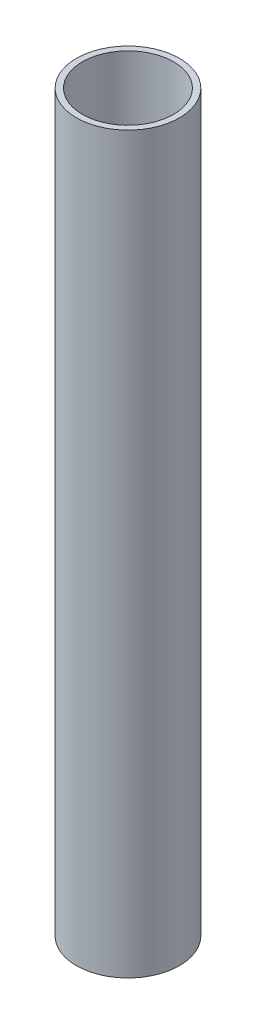
ISO-10303-21;
HEADER;
FILE_DESCRIPTION(('STEP AP214'),'2;1');
FILE_NAME('part.step','',(''),(''),'','','');
FILE_SCHEMA(('AUTOMOTIVE_DESIGN { 1 0 10303 214 1 1 1 1 }'));
ENDSEC;
DATA;
#1=APPLICATION_CONTEXT('core data for automotive mechanical design processes');
#2=APPLICATION_PROTOCOL_DEFINITION('international standard','automotive_design',2000,#1);
#3=PRODUCT_CONTEXT('',#1,'mechanical');
#4=PRODUCT('Part','Part','',(#3));
#5=PRODUCT_RELATED_PRODUCT_CATEGORY('part','',(#4));
#6=PRODUCT_DEFINITION_FORMATION('','',#4);
#7=PRODUCT_DEFINITION_CONTEXT('part definition',#1,'design');
#8=PRODUCT_DEFINITION('design','',#6,#7);
#9=PRODUCT_DEFINITION_SHAPE('','',#8);
#10=(LENGTH_UNIT() NAMED_UNIT(*) SI_UNIT(.MILLI.,.METRE.));
#11=(NAMED_UNIT(*) PLANE_ANGLE_UNIT() SI_UNIT($,.RADIAN.));
#12=(NAMED_UNIT(*) SI_UNIT($,.STERADIAN.) SOLID_ANGLE_UNIT());
#13=UNCERTAINTY_MEASURE_WITH_UNIT(LENGTH_MEASURE(1.E-05),#10,'distance_accuracy_value','');
#14=(GEOMETRIC_REPRESENTATION_CONTEXT(3) GLOBAL_UNCERTAINTY_ASSIGNED_CONTEXT((#13)) GLOBAL_UNIT_ASSIGNED_CONTEXT((#10,
#11,#12)) REPRESENTATION_CONTEXT('',''));
#15=CARTESIAN_POINT('',(0.,0.,0.));
#16=DIRECTION('',(0.,0.,1.));
#17=DIRECTION('',(1.,0.,0.));
#18=AXIS2_PLACEMENT_3D('',#15,#16,#17);
#19=CARTESIAN_POINT('',(0.,285.,0.));
#20=DIRECTION('',(0.,1.,0.));
#21=DIRECTION('',(0.,0.,1.));
#22=AXIS2_PLACEMENT_3D('',#19,#20,#21);
#23=PLANE('',#22);
#24=CARTESIAN_POINT('',(0.,285.,0.));
#25=DIRECTION('',(0.,1.,0.));
#26=DIRECTION('',(0.,0.,1.));
#27=AXIS2_PLACEMENT_3D('',#24,#25,#26);
#28=CIRCLE('',#27,20.);
#29=CARTESIAN_POINT('',(0.,285.,20.));
#30=VERTEX_POINT('',#29);
#31=EDGE_CURVE('E10',#30,#30,#28,.T.);
#32=ORIENTED_EDGE('',*,*,#31,.T.);
#33=EDGE_LOOP('',(#32));
#34=FACE_BOUND('',#33,.T.);
#35=CARTESIAN_POINT('',(0.,285.,0.));
#36=DIRECTION('',(0.,1.,0.));
#37=DIRECTION('',(0.,0.,1.));
#38=AXIS2_PLACEMENT_3D('',#35,#36,#37);
#39=CIRCLE('',#38,17.7);
#40=CARTESIAN_POINT('',(0.,285.,17.7));
#41=VERTEX_POINT('',#40);
#42=EDGE_CURVE('E43',#41,#41,#39,.T.);
#43=ORIENTED_EDGE('',*,*,#42,.F.);
#44=EDGE_LOOP('',(#43));
#45=FACE_BOUND('',#44,.T.);
#46=ADVANCED_FACE('F32',(#34,#45),#23,.T.);
#47=CARTESIAN_POINT('',(0.,0.,0.));
#48=DIRECTION('',(0.,1.,0.));
#49=DIRECTION('',(0.,0.,1.));
#50=AXIS2_PLACEMENT_3D('',#47,#48,#49);
#51=PLANE('',#50);
#52=CARTESIAN_POINT('',(0.,0.,0.));
#53=DIRECTION('',(0.,1.,0.));
#54=DIRECTION('',(0.,0.,1.));
#55=AXIS2_PLACEMENT_3D('',#52,#53,#54);
#56=CIRCLE('',#55,20.);
#57=CARTESIAN_POINT('',(0.,0.,20.));
#58=VERTEX_POINT('',#57);
#59=EDGE_CURVE('E36',#58,#58,#56,.T.);
#60=ORIENTED_EDGE('',*,*,#59,.F.);
#61=EDGE_LOOP('',(#60));
#62=FACE_BOUND('',#61,.T.);
#63=CARTESIAN_POINT('',(0.,0.,0.));
#64=DIRECTION('',(0.,1.,0.));
#65=DIRECTION('',(0.,0.,1.));
#66=AXIS2_PLACEMENT_3D('',#63,#64,#65);
#67=CIRCLE('',#66,17.7);
#68=CARTESIAN_POINT('',(0.,0.,17.7));
#69=VERTEX_POINT('',#68);
#70=EDGE_CURVE('E45',#69,#69,#67,.T.);
#71=ORIENTED_EDGE('',*,*,#70,.T.);
#72=EDGE_LOOP('',(#71));
#73=FACE_BOUND('',#72,.T.);
#74=ADVANCED_FACE('F55',(#62,#73),#51,.F.);
#75=CARTESIAN_POINT('',(0.,285.,0.));
#76=DIRECTION('',(0.,-1.,0.));
#77=DIRECTION('',(0.,0.,-1.));
#78=AXIS2_PLACEMENT_3D('',#75,#76,#77);
#79=CYLINDRICAL_SURFACE('',#78,20.);
#80=ORIENTED_EDGE('',*,*,#31,.F.);
#81=EDGE_LOOP('',(#80));
#82=FACE_BOUND('',#81,.T.);
#83=ORIENTED_EDGE('',*,*,#59,.T.);
#84=EDGE_LOOP('',(#83));
#85=FACE_BOUND('',#84,.T.);
#86=ADVANCED_FACE('F34',(#82,#85),#79,.T.);
#87=CARTESIAN_POINT('',(0.,285.,0.));
#88=DIRECTION('',(0.,-1.,0.));
#89=DIRECTION('',(0.,0.,-1.));
#90=AXIS2_PLACEMENT_3D('',#87,#88,#89);
#91=CYLINDRICAL_SURFACE('',#90,17.7);
#92=ORIENTED_EDGE('',*,*,#42,.T.);
#93=EDGE_LOOP('',(#92));
#94=FACE_BOUND('',#93,.T.);
#95=ORIENTED_EDGE('',*,*,#70,.F.);
#96=EDGE_LOOP('',(#95));
#97=FACE_BOUND('',#96,.T.);
#98=ADVANCED_FACE('F51',(#94,#97),#91,.F.);
#99=CLOSED_SHELL('',(#46,#74,#86,#98));
#100=MANIFOLD_SOLID_BREP('B2',#99);
#101=ADVANCED_BREP_SHAPE_REPRESENTATION('',(#18,#100),#14);
#102=SHAPE_DEFINITION_REPRESENTATION(#9,#101);
ENDSEC;
END-ISO-10303-21;
